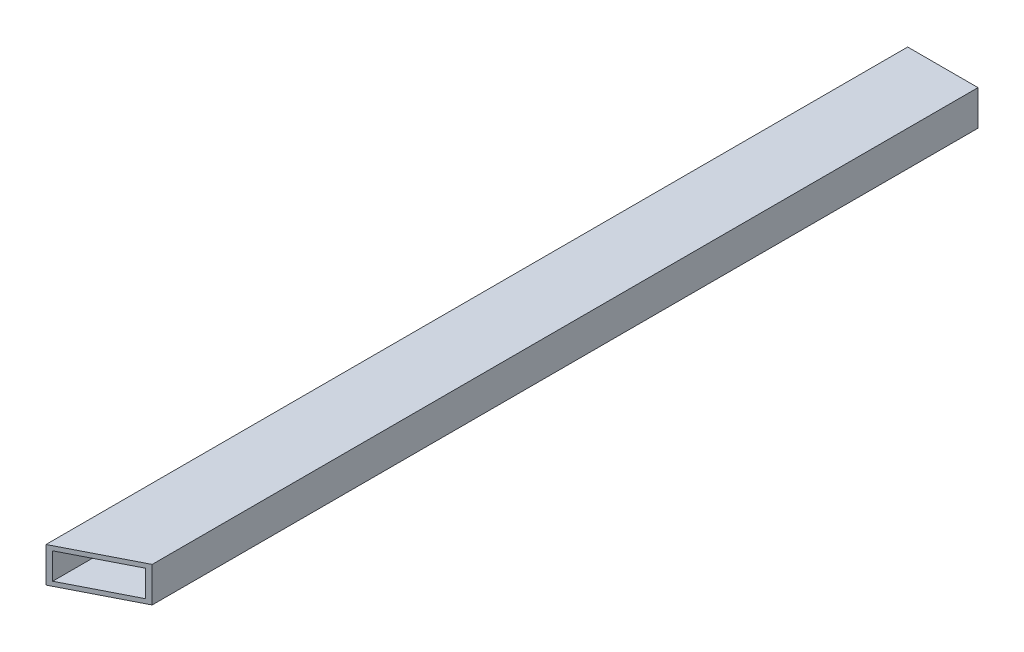
ISO-10303-21;
HEADER;
FILE_DESCRIPTION(('STEP AP214'),'2;1');
FILE_NAME('part.step','',(''),(''),'','','');
FILE_SCHEMA(('AUTOMOTIVE_DESIGN { 1 0 10303 214 1 1 1 1 }'));
ENDSEC;
DATA;
#1=APPLICATION_CONTEXT('core data for automotive mechanical design processes');
#2=APPLICATION_PROTOCOL_DEFINITION('international standard','automotive_design',2000,#1);
#3=PRODUCT_CONTEXT('',#1,'mechanical');
#4=PRODUCT('Part','Part','',(#3));
#5=PRODUCT_RELATED_PRODUCT_CATEGORY('part','',(#4));
#6=PRODUCT_DEFINITION_FORMATION('','',#4);
#7=PRODUCT_DEFINITION_CONTEXT('part definition',#1,'design');
#8=PRODUCT_DEFINITION('design','',#6,#7);
#9=PRODUCT_DEFINITION_SHAPE('','',#8);
#10=(LENGTH_UNIT() NAMED_UNIT(*) SI_UNIT(.MILLI.,.METRE.));
#11=(NAMED_UNIT(*) PLANE_ANGLE_UNIT() SI_UNIT($,.RADIAN.));
#12=(NAMED_UNIT(*) SI_UNIT($,.STERADIAN.) SOLID_ANGLE_UNIT());
#13=UNCERTAINTY_MEASURE_WITH_UNIT(LENGTH_MEASURE(1.E-05),#10,'distance_accuracy_value','');
#14=(GEOMETRIC_REPRESENTATION_CONTEXT(3) GLOBAL_UNCERTAINTY_ASSIGNED_CONTEXT((#13)) GLOBAL_UNIT_ASSIGNED_CONTEXT((#10,
#11,#12)) REPRESENTATION_CONTEXT('',''));
#15=CARTESIAN_POINT('',(0.,0.,0.));
#16=DIRECTION('',(0.,0.,1.));
#17=DIRECTION('',(1.,0.,0.));
#18=AXIS2_PLACEMENT_3D('',#15,#16,#17);
#19=CARTESIAN_POINT('',(0.,0.,0.));
#20=DIRECTION('',(0.,0.,-1.));
#21=DIRECTION('',(-1.,0.,0.));
#22=AXIS2_PLACEMENT_3D('',#19,#20,#21);
#23=PLANE('',#22);
#24=DIRECTION('',(0.,1.,0.));
#25=VECTOR('',#24,1.);
#26=CARTESIAN_POINT('',(25.4,-12.7,0.));
#27=LINE('',#26,#25);
#28=CARTESIAN_POINT('',(25.4,-12.7,0.));
#29=VERTEX_POINT('',#28);
#30=CARTESIAN_POINT('',(25.4,12.7,0.));
#31=VERTEX_POINT('',#30);
#32=EDGE_CURVE('E132',#29,#31,#27,.T.);
#33=ORIENTED_EDGE('',*,*,#32,.F.);
#34=DIRECTION('',(1.,0.,0.));
#35=VECTOR('',#34,1.);
#36=CARTESIAN_POINT('',(-25.4,-12.7,0.));
#37=LINE('',#36,#35);
#38=CARTESIAN_POINT('',(-25.4,-12.7,0.));
#39=VERTEX_POINT('',#38);
#40=EDGE_CURVE('E145',#39,#29,#37,.T.);
#41=ORIENTED_EDGE('',*,*,#40,.F.);
#42=DIRECTION('',(0.,-1.,0.));
#43=VECTOR('',#42,1.);
#44=CARTESIAN_POINT('',(-25.4,-12.7,0.));
#45=LINE('',#44,#43);
#46=CARTESIAN_POINT('',(-25.4,12.7,0.));
#47=VERTEX_POINT('',#46);
#48=EDGE_CURVE('E149',#47,#39,#45,.T.);
#49=ORIENTED_EDGE('',*,*,#48,.F.);
#50=DIRECTION('',(-1.,0.,0.));
#51=VECTOR('',#50,1.);
#52=CARTESIAN_POINT('',(-25.4,12.7,0.));
#53=LINE('',#52,#51);
#54=EDGE_CURVE('E152',#31,#47,#53,.T.);
#55=ORIENTED_EDGE('',*,*,#54,.F.);
#56=EDGE_LOOP('',(#33,#41,#49,#55));
#57=FACE_BOUND('',#56,.T.);
#58=DIRECTION('',(1.,0.,0.));
#59=VECTOR('',#58,1.);
#60=CARTESIAN_POINT('',(-22.225,-9.525,0.));
#61=LINE('',#60,#59);
#62=CARTESIAN_POINT('',(-22.225,-9.525,0.));
#63=VERTEX_POINT('',#62);
#64=CARTESIAN_POINT('',(22.225,-9.525,0.));
#65=VERTEX_POINT('',#64);
#66=EDGE_CURVE('E170',#63,#65,#61,.T.);
#67=ORIENTED_EDGE('',*,*,#66,.T.);
#68=DIRECTION('',(0.,1.,0.));
#69=VECTOR('',#68,1.);
#70=CARTESIAN_POINT('',(22.225,-9.525,0.));
#71=LINE('',#70,#69);
#72=CARTESIAN_POINT('',(22.225,9.525,0.));
#73=VERTEX_POINT('',#72);
#74=EDGE_CURVE('E182',#65,#73,#71,.T.);
#75=ORIENTED_EDGE('',*,*,#74,.T.);
#76=DIRECTION('',(-1.,0.,0.));
#77=VECTOR('',#76,1.);
#78=CARTESIAN_POINT('',(-22.225,9.525,0.));
#79=LINE('',#78,#77);
#80=CARTESIAN_POINT('',(-22.225,9.525,0.));
#81=VERTEX_POINT('',#80);
#82=EDGE_CURVE('E178',#73,#81,#79,.T.);
#83=ORIENTED_EDGE('',*,*,#82,.T.);
#84=DIRECTION('',(0.,-1.,0.));
#85=VECTOR('',#84,1.);
#86=CARTESIAN_POINT('',(-22.225,-9.525,0.));
#87=LINE('',#86,#85);
#88=EDGE_CURVE('E174',#81,#63,#87,.T.);
#89=ORIENTED_EDGE('',*,*,#88,.T.);
#90=EDGE_LOOP('',(#67,#75,#83,#89));
#91=FACE_BOUND('',#90,.T.);
#92=ADVANCED_FACE('F45',(#57,#91),#23,.T.);
#93=CARTESIAN_POINT('',(25.4,-12.7,622.3));
#94=DIRECTION('',(-1.,0.,0.));
#95=DIRECTION('',(0.,0.,1.));
#96=AXIS2_PLACEMENT_3D('',#93,#94,#95);
#97=PLANE('',#96);
#98=DIRECTION('',(0.,0.,-1.));
#99=VECTOR('',#98,1.);
#100=CARTESIAN_POINT('',(25.4,12.7,622.3));
#101=LINE('',#100,#99);
#102=CARTESIAN_POINT('',(25.4,12.7,596.416107165683));
#103=VERTEX_POINT('',#102);
#104=EDGE_CURVE('E54',#103,#31,#101,.T.);
#105=ORIENTED_EDGE('',*,*,#104,.F.);
#106=DIRECTION('',(0.,1.,0.));
#107=VECTOR('',#106,1.);
#108=CARTESIAN_POINT('',(25.4,-69.7141728718255,596.416107165683));
#109=LINE('',#108,#107);
#110=CARTESIAN_POINT('',(25.4,-12.7,596.416107165683));
#111=VERTEX_POINT('',#110);
#112=EDGE_CURVE('E110',#111,#103,#109,.T.);
#113=ORIENTED_EDGE('',*,*,#112,.F.);
#114=DIRECTION('',(0.,0.,-1.));
#115=VECTOR('',#114,1.);
#116=CARTESIAN_POINT('',(25.4,-12.7,622.3));
#117=LINE('',#116,#115);
#118=EDGE_CURVE('E141',#111,#29,#117,.T.);
#119=ORIENTED_EDGE('',*,*,#118,.T.);
#120=ORIENTED_EDGE('',*,*,#32,.T.);
#121=EDGE_LOOP('',(#105,#113,#119,#120));
#122=FACE_BOUND('',#121,.T.);
#123=ADVANCED_FACE('F47',(#122),#97,.F.);
#124=CARTESIAN_POINT('',(-25.4,12.7,622.3));
#125=DIRECTION('',(0.,-1.,0.));
#126=DIRECTION('',(0.,0.,-1.));
#127=AXIS2_PLACEMENT_3D('',#124,#125,#126);
#128=PLANE('',#127);
#129=DIRECTION('',(0.,0.,-1.));
#130=VECTOR('',#129,1.);
#131=CARTESIAN_POINT('',(-25.4,12.7,622.3));
#132=LINE('',#131,#130);
#133=CARTESIAN_POINT('',(-25.4,12.7,622.3));
#134=VERTEX_POINT('',#133);
#135=EDGE_CURVE('E126',#134,#47,#132,.T.);
#136=ORIENTED_EDGE('',*,*,#135,.F.);
#137=DIRECTION('',(-0.891006524188369,0.,0.453990499739544));
#138=VECTOR('',#137,1.);
#139=CARTESIAN_POINT('',(-25.4,12.7,622.3));
#140=LINE('',#139,#138);
#141=EDGE_CURVE('E113',#103,#134,#140,.T.);
#142=ORIENTED_EDGE('',*,*,#141,.F.);
#143=ORIENTED_EDGE('',*,*,#104,.T.);
#144=ORIENTED_EDGE('',*,*,#54,.T.);
#145=EDGE_LOOP('',(#136,#142,#143,#144));
#146=FACE_BOUND('',#145,.T.);
#147=ADVANCED_FACE('F123',(#146),#128,.F.);
#148=CARTESIAN_POINT('',(-25.4,-12.7,622.3));
#149=DIRECTION('',(1.,0.,0.));
#150=DIRECTION('',(0.,0.,-1.));
#151=AXIS2_PLACEMENT_3D('',#148,#149,#150);
#152=PLANE('',#151);
#153=ORIENTED_EDGE('',*,*,#48,.T.);
#154=DIRECTION('',(0.,0.,-1.));
#155=VECTOR('',#154,1.);
#156=CARTESIAN_POINT('',(-25.4,-12.7,622.3));
#157=LINE('',#156,#155);
#158=CARTESIAN_POINT('',(-25.4,-12.7,622.3));
#159=VERTEX_POINT('',#158);
#160=EDGE_CURVE('E135',#159,#39,#157,.T.);
#161=ORIENTED_EDGE('',*,*,#160,.F.);
#162=DIRECTION('',(0.,-1.,0.));
#163=VECTOR('',#162,1.);
#164=CARTESIAN_POINT('',(-25.4,-12.7,622.3));
#165=LINE('',#164,#163);
#166=EDGE_CURVE('E144',#134,#159,#165,.T.);
#167=ORIENTED_EDGE('',*,*,#166,.F.);
#168=ORIENTED_EDGE('',*,*,#135,.T.);
#169=EDGE_LOOP('',(#153,#161,#167,#168));
#170=FACE_BOUND('',#169,.T.);
#171=ADVANCED_FACE('F217',(#170),#152,.F.);
#172=CARTESIAN_POINT('',(-25.4,-12.7,622.3));
#173=DIRECTION('',(0.,1.,0.));
#174=DIRECTION('',(0.,0.,1.));
#175=AXIS2_PLACEMENT_3D('',#172,#173,#174);
#176=PLANE('',#175);
#177=ORIENTED_EDGE('',*,*,#118,.F.);
#178=DIRECTION('',(0.891006524188369,0.,-0.453990499739544));
#179=VECTOR('',#178,1.);
#180=CARTESIAN_POINT('',(-25.4,-12.7,622.3));
#181=LINE('',#180,#179);
#182=EDGE_CURVE('E116',#159,#111,#181,.T.);
#183=ORIENTED_EDGE('',*,*,#182,.F.);
#184=ORIENTED_EDGE('',*,*,#160,.T.);
#185=ORIENTED_EDGE('',*,*,#40,.T.);
#186=EDGE_LOOP('',(#177,#183,#184,#185));
#187=FACE_BOUND('',#186,.T.);
#188=ADVANCED_FACE('F210',(#187),#176,.F.);
#189=CARTESIAN_POINT('',(22.225,-9.525,622.3));
#190=DIRECTION('',(-1.,0.,0.));
#191=DIRECTION('',(0.,0.,1.));
#192=AXIS2_PLACEMENT_3D('',#189,#190,#191);
#193=PLANE('',#192);
#194=DIRECTION('',(0.,-1.,0.));
#195=VECTOR('',#194,1.);
#196=CARTESIAN_POINT('',(22.225,-9.525,598.033850467828));
#197=LINE('',#196,#195);
#198=CARTESIAN_POINT('',(22.225,9.525,598.033850467828));
#199=VERTEX_POINT('',#198);
#200=CARTESIAN_POINT('',(22.225,-9.525,598.033850467828));
#201=VERTEX_POINT('',#200);
#202=EDGE_CURVE('E60',#199,#201,#197,.T.);
#203=ORIENTED_EDGE('',*,*,#202,.F.);
#204=DIRECTION('',(0.,0.,-1.));
#205=VECTOR('',#204,1.);
#206=CARTESIAN_POINT('',(22.225,9.525,622.3));
#207=LINE('',#206,#205);
#208=EDGE_CURVE('E157',#199,#73,#207,.T.);
#209=ORIENTED_EDGE('',*,*,#208,.T.);
#210=ORIENTED_EDGE('',*,*,#74,.F.);
#211=DIRECTION('',(0.,0.,-1.));
#212=VECTOR('',#211,1.);
#213=CARTESIAN_POINT('',(22.225,-9.525,622.3));
#214=LINE('',#213,#212);
#215=EDGE_CURVE('E67',#201,#65,#214,.T.);
#216=ORIENTED_EDGE('',*,*,#215,.F.);
#217=EDGE_LOOP('',(#203,#209,#210,#216));
#218=FACE_BOUND('',#217,.T.);
#219=ADVANCED_FACE('F208',(#218),#193,.T.);
#220=CARTESIAN_POINT('',(-22.225,9.525,622.3));
#221=DIRECTION('',(0.,-1.,0.));
#222=DIRECTION('',(0.,0.,-1.));
#223=AXIS2_PLACEMENT_3D('',#220,#221,#222);
#224=PLANE('',#223);
#225=DIRECTION('',(0.891006524188369,0.,-0.453990499739544));
#226=VECTOR('',#225,1.);
#227=CARTESIAN_POINT('',(-22.8793909119857,9.525,621.01568552143));
#228=LINE('',#227,#226);
#229=CARTESIAN_POINT('',(-22.225,9.525,620.682256697855));
#230=VERTEX_POINT('',#229);
#231=EDGE_CURVE('E188',#230,#199,#228,.T.);
#232=ORIENTED_EDGE('',*,*,#231,.F.);
#233=DIRECTION('',(0.,0.,-1.));
#234=VECTOR('',#233,1.);
#235=CARTESIAN_POINT('',(-22.225,9.525,622.3));
#236=LINE('',#235,#234);
#237=EDGE_CURVE('E162',#230,#81,#236,.T.);
#238=ORIENTED_EDGE('',*,*,#237,.T.);
#239=ORIENTED_EDGE('',*,*,#82,.F.);
#240=ORIENTED_EDGE('',*,*,#208,.F.);
#241=EDGE_LOOP('',(#232,#238,#239,#240));
#242=FACE_BOUND('',#241,.T.);
#243=ADVANCED_FACE('F202',(#242),#224,.T.);
#244=CARTESIAN_POINT('',(-22.225,-9.525,622.3));
#245=DIRECTION('',(1.,0.,0.));
#246=DIRECTION('',(0.,0.,-1.));
#247=AXIS2_PLACEMENT_3D('',#244,#245,#246);
#248=PLANE('',#247);
#249=DIRECTION('',(0.,1.,0.));
#250=VECTOR('',#249,1.);
#251=CARTESIAN_POINT('',(-22.225,-9.525,620.682256697855));
#252=LINE('',#251,#250);
#253=CARTESIAN_POINT('',(-22.225,-9.525,620.682256697855));
#254=VERTEX_POINT('',#253);
#255=EDGE_CURVE('E191',#254,#230,#252,.T.);
#256=ORIENTED_EDGE('',*,*,#255,.F.);
#257=DIRECTION('',(0.,0.,-1.));
#258=VECTOR('',#257,1.);
#259=CARTESIAN_POINT('',(-22.225,-9.525,622.3));
#260=LINE('',#259,#258);
#261=EDGE_CURVE('E165',#254,#63,#260,.T.);
#262=ORIENTED_EDGE('',*,*,#261,.T.);
#263=ORIENTED_EDGE('',*,*,#88,.F.);
#264=ORIENTED_EDGE('',*,*,#237,.F.);
#265=EDGE_LOOP('',(#256,#262,#263,#264));
#266=FACE_BOUND('',#265,.T.);
#267=ADVANCED_FACE('F205',(#266),#248,.T.);
#268=CARTESIAN_POINT('',(-22.225,-9.525,622.3));
#269=DIRECTION('',(0.,1.,0.));
#270=DIRECTION('',(0.,0.,1.));
#271=AXIS2_PLACEMENT_3D('',#268,#269,#270);
#272=PLANE('',#271);
#273=DIRECTION('',(-0.891006524188369,0.,0.453990499739544));
#274=VECTOR('',#273,1.);
#275=CARTESIAN_POINT('',(-22.8793909119857,-9.525,621.01568552143));
#276=LINE('',#275,#274);
#277=EDGE_CURVE('E11',#201,#254,#276,.T.);
#278=ORIENTED_EDGE('',*,*,#277,.F.);
#279=ORIENTED_EDGE('',*,*,#215,.T.);
#280=ORIENTED_EDGE('',*,*,#66,.F.);
#281=ORIENTED_EDGE('',*,*,#261,.F.);
#282=EDGE_LOOP('',(#278,#279,#280,#281));
#283=FACE_BOUND('',#282,.T.);
#284=ADVANCED_FACE('F264',(#283),#272,.T.);
#285=CARTESIAN_POINT('',(-25.4,-69.7141728718255,622.3));
#286=DIRECTION('',(-0.453990499739544,0.,-0.891006524188369));
#287=DIRECTION('',(-0.891006524188369,0.,0.453990499739544));
#288=AXIS2_PLACEMENT_3D('',#285,#286,#287);
#289=PLANE('',#288);
#290=ORIENTED_EDGE('',*,*,#202,.T.);
#291=ORIENTED_EDGE('',*,*,#277,.T.);
#292=ORIENTED_EDGE('',*,*,#255,.T.);
#293=ORIENTED_EDGE('',*,*,#231,.T.);
#294=EDGE_LOOP('',(#290,#291,#292,#293));
#295=FACE_BOUND('',#294,.T.);
#296=ORIENTED_EDGE('',*,*,#182,.T.);
#297=ORIENTED_EDGE('',*,*,#112,.T.);
#298=ORIENTED_EDGE('',*,*,#141,.T.);
#299=ORIENTED_EDGE('',*,*,#166,.T.);
#300=EDGE_LOOP('',(#296,#297,#298,#299));
#301=FACE_BOUND('',#300,.T.);
#302=ADVANCED_FACE('F112',(#295,#301),#289,.F.);
#303=CLOSED_SHELL('',(#92,#123,#147,#171,#188,#219,#243,#267,#284,#302));
#304=MANIFOLD_SOLID_BREP('B2',#303);
#305=ADVANCED_BREP_SHAPE_REPRESENTATION('',(#18,#304),#14);
#306=SHAPE_DEFINITION_REPRESENTATION(#9,#305);
ENDSEC;
END-ISO-10303-21;
